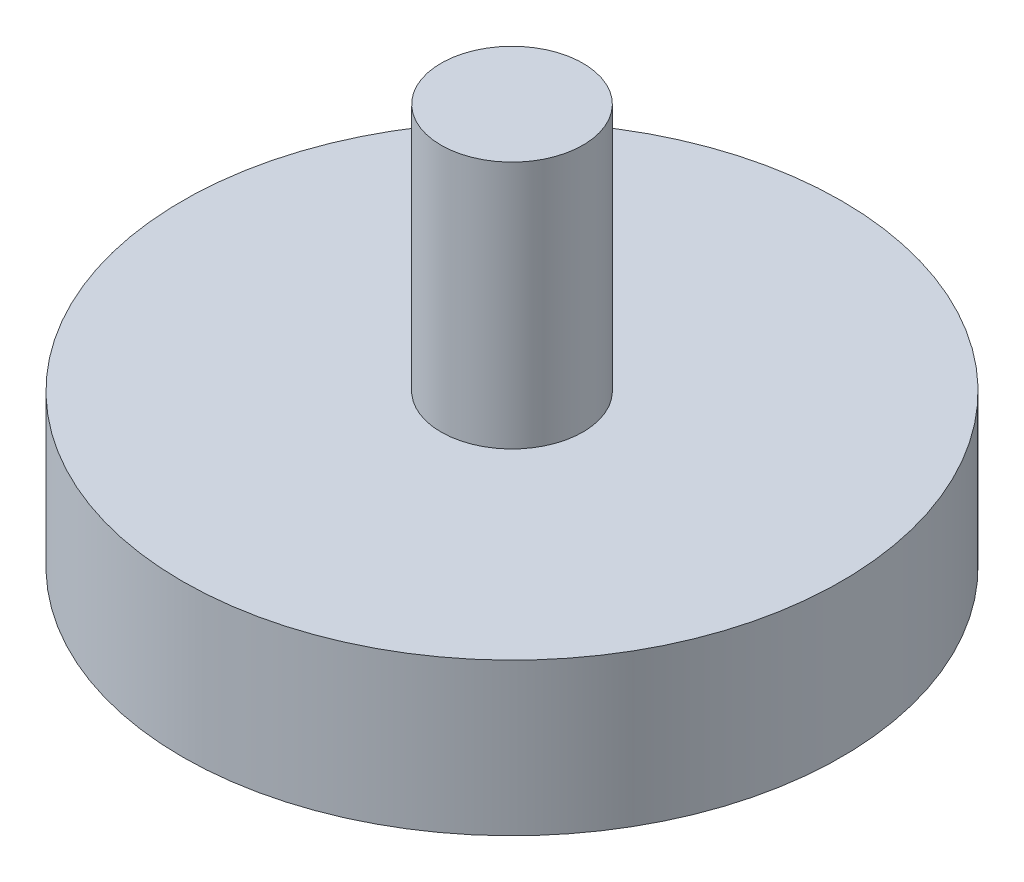
ISO-10303-21;
HEADER;
FILE_DESCRIPTION(('STEP AP214'),'2;1');
FILE_NAME('part.step','',(''),(''),'','','');
FILE_SCHEMA(('AUTOMOTIVE_DESIGN { 1 0 10303 214 1 1 1 1 }'));
ENDSEC;
DATA;
#1=APPLICATION_CONTEXT('core data for automotive mechanical design processes');
#2=APPLICATION_PROTOCOL_DEFINITION('international standard','automotive_design',2000,#1);
#3=PRODUCT_CONTEXT('',#1,'mechanical');
#4=PRODUCT('Part','Part','',(#3));
#5=PRODUCT_RELATED_PRODUCT_CATEGORY('part','',(#4));
#6=PRODUCT_DEFINITION_FORMATION('','',#4);
#7=PRODUCT_DEFINITION_CONTEXT('part definition',#1,'design');
#8=PRODUCT_DEFINITION('design','',#6,#7);
#9=PRODUCT_DEFINITION_SHAPE('','',#8);
#10=(LENGTH_UNIT() NAMED_UNIT(*) SI_UNIT(.MILLI.,.METRE.));
#11=(NAMED_UNIT(*) PLANE_ANGLE_UNIT() SI_UNIT($,.RADIAN.));
#12=(NAMED_UNIT(*) SI_UNIT($,.STERADIAN.) SOLID_ANGLE_UNIT());
#13=UNCERTAINTY_MEASURE_WITH_UNIT(LENGTH_MEASURE(1.E-05),#10,'distance_accuracy_value','');
#14=(GEOMETRIC_REPRESENTATION_CONTEXT(3) GLOBAL_UNCERTAINTY_ASSIGNED_CONTEXT((#13)) GLOBAL_UNIT_ASSIGNED_CONTEXT((#10,
#11,#12)) REPRESENTATION_CONTEXT('',''));
#15=CARTESIAN_POINT('',(0.,0.,0.));
#16=DIRECTION('',(0.,0.,1.));
#17=DIRECTION('',(1.,0.,0.));
#18=AXIS2_PLACEMENT_3D('',#15,#16,#17);
#19=CARTESIAN_POINT('',(0.,-7.62,0.));
#20=DIRECTION('',(0.,1.,0.));
#21=DIRECTION('',(0.,0.,1.));
#22=AXIS2_PLACEMENT_3D('',#19,#20,#21);
#23=CYLINDRICAL_SURFACE('',#22,16.51);
#24=CARTESIAN_POINT('',(0.,-7.62,0.));
#25=DIRECTION('',(0.,1.,0.));
#26=DIRECTION('',(0.,0.,1.));
#27=AXIS2_PLACEMENT_3D('',#24,#25,#26);
#28=CIRCLE('',#27,16.51);
#29=CARTESIAN_POINT('',(0.,-7.62,16.51));
#30=VERTEX_POINT('',#29);
#31=EDGE_CURVE('E11',#30,#30,#28,.T.);
#32=CARTESIAN_POINT('',(0.,0.,0.));
#33=DIRECTION('',(0.,1.,0.));
#34=DIRECTION('',(0.,0.,1.));
#35=AXIS2_PLACEMENT_3D('',#32,#33,#34);
#36=CIRCLE('',#35,16.51);
#37=CARTESIAN_POINT('',(0.,0.,16.51));
#38=VERTEX_POINT('',#37);
#39=EDGE_CURVE('E50',#38,#38,#36,.T.);
#40=CARTESIAN_POINT('',(0.,-7.62,16.51));
#41=CARTESIAN_POINT('',(0.,-7.540625,16.51));
#42=CARTESIAN_POINT('',(0.,-7.46125,16.51));
#43=CARTESIAN_POINT('',(0.,-7.3025,16.51));
#44=CARTESIAN_POINT('',(0.,-7.223125,16.51));
#45=CARTESIAN_POINT('',(0.,-7.064375,16.51));
#46=CARTESIAN_POINT('',(0.,-6.985,16.51));
#47=CARTESIAN_POINT('',(0.,-6.82625,16.51));
#48=CARTESIAN_POINT('',(0.,-6.746875,16.51));
#49=CARTESIAN_POINT('',(0.,-6.588125,16.51));
#50=CARTESIAN_POINT('',(0.,-6.50875,16.51));
#51=CARTESIAN_POINT('',(0.,-6.35,16.51));
#52=CARTESIAN_POINT('',(0.,-6.270625,16.51));
#53=CARTESIAN_POINT('',(0.,-6.111875,16.51));
#54=CARTESIAN_POINT('',(0.,-6.0325,16.51));
#55=CARTESIAN_POINT('',(0.,-5.87375,16.51));
#56=CARTESIAN_POINT('',(0.,-5.794375,16.51));
#57=CARTESIAN_POINT('',(0.,-5.635625,16.51));
#58=CARTESIAN_POINT('',(0.,-5.55625,16.51));
#59=CARTESIAN_POINT('',(0.,-5.3975,16.51));
#60=CARTESIAN_POINT('',(0.,-5.318125,16.51));
#61=CARTESIAN_POINT('',(0.,-5.159375,16.51));
#62=CARTESIAN_POINT('',(0.,-5.08,16.51));
#63=CARTESIAN_POINT('',(0.,-4.92125,16.51));
#64=CARTESIAN_POINT('',(0.,-4.841875,16.51));
#65=CARTESIAN_POINT('',(0.,-4.683125,16.51));
#66=CARTESIAN_POINT('',(0.,-4.60375,16.51));
#67=CARTESIAN_POINT('',(0.,-4.445,16.51));
#68=CARTESIAN_POINT('',(0.,-4.365625,16.51));
#69=CARTESIAN_POINT('',(0.,-4.206875,16.51));
#70=CARTESIAN_POINT('',(0.,-4.1275,16.51));
#71=CARTESIAN_POINT('',(0.,-3.96875,16.51));
#72=CARTESIAN_POINT('',(0.,-3.889375,16.51));
#73=CARTESIAN_POINT('',(0.,-3.730625,16.51));
#74=CARTESIAN_POINT('',(0.,-3.65125,16.51));
#75=CARTESIAN_POINT('',(0.,-3.4925,16.51));
#76=CARTESIAN_POINT('',(0.,-3.413125,16.51));
#77=CARTESIAN_POINT('',(0.,-3.254375,16.51));
#78=CARTESIAN_POINT('',(0.,-3.175,16.51));
#79=CARTESIAN_POINT('',(0.,-3.01625,16.51));
#80=CARTESIAN_POINT('',(0.,-2.936875,16.51));
#81=CARTESIAN_POINT('',(0.,-2.778125,16.51));
#82=CARTESIAN_POINT('',(0.,-2.69875,16.51));
#83=CARTESIAN_POINT('',(0.,-2.54,16.51));
#84=CARTESIAN_POINT('',(0.,-2.460625,16.51));
#85=CARTESIAN_POINT('',(0.,-2.301875,16.51));
#86=CARTESIAN_POINT('',(0.,-2.2225,16.51));
#87=CARTESIAN_POINT('',(0.,-2.06375,16.51));
#88=CARTESIAN_POINT('',(0.,-1.984375,16.51));
#89=CARTESIAN_POINT('',(0.,-1.825625,16.51));
#90=CARTESIAN_POINT('',(0.,-1.74625,16.51));
#91=CARTESIAN_POINT('',(0.,-1.5875,16.51));
#92=CARTESIAN_POINT('',(0.,-1.508125,16.51));
#93=CARTESIAN_POINT('',(0.,-1.349375,16.51));
#94=CARTESIAN_POINT('',(0.,-1.27,16.51));
#95=CARTESIAN_POINT('',(0.,-1.11125,16.51));
#96=CARTESIAN_POINT('',(0.,-1.031875,16.51));
#97=CARTESIAN_POINT('',(0.,-0.873125,16.51));
#98=CARTESIAN_POINT('',(0.,-0.79375,16.51));
#99=CARTESIAN_POINT('',(0.,-0.635,16.51));
#100=CARTESIAN_POINT('',(0.,-0.555625,16.51));
#101=CARTESIAN_POINT('',(0.,-0.396875,16.51));
#102=CARTESIAN_POINT('',(0.,-0.3175,16.51));
#103=CARTESIAN_POINT('',(0.,-0.15875,16.51));
#104=CARTESIAN_POINT('',(0.,-0.0793749999999999,16.51));
#105=CARTESIAN_POINT('',(0.,0.,16.51));
#106=B_SPLINE_CURVE_WITH_KNOTS('',3,(#40,#41,#42,#43,#44,#45,#46,#47,#48,#49,#50,#51,#52,#53,
#54,#55,#56,#57,#58,#59,#60,#61,#62,#63,#64,#65,#66,#67,#68,#69,#70,#71,#72,#73,#74,#75,#76,#77,
#78,#79,#80,#81,#82,#83,#84,#85,#86,#87,#88,#89,#90,#91,#92,#93,#94,#95,#96,#97,#98,#99,#100,
#101,#102,#103,#104,#105),.UNSPECIFIED.,.F.,.F.,(4,2,2,2,2,2,2,2,2,2,2,2,2,2,2,2,2,2,2,2,2,2,2,
2,2,2,2,2,2,2,2,2,4),(0.,0.238125,0.476249999999999,0.714375,0.952499999999999,1.190625,1.42875,
1.666875,1.905,2.143125,2.38125,2.619375,2.8575,3.095625,3.33375,3.571875,3.81,4.048125,4.28625,
4.524375,4.7625,5.000625,5.23875,5.476875,5.715,5.953125,6.19125,6.429375,6.6675,6.905625,
7.14375,7.381875,7.62),.UNSPECIFIED.);
#107=EDGE_CURVE('BSEAM47',#30,#38,#106,.T.);
#108=ORIENTED_EDGE('',*,*,#31,.T.);
#109=ORIENTED_EDGE('',*,*,#39,.F.);
#110=ORIENTED_EDGE('',*,*,#107,.T.);
#111=ORIENTED_EDGE('',*,*,#107,.F.);
#112=EDGE_LOOP('',(#108,#110,#109,#111));
#113=FACE_BOUND('',#112,.T.);
#114=ADVANCED_FACE('F47',(#113),#23,.T.);
#115=CARTESIAN_POINT('',(0.,-7.62,0.));
#116=DIRECTION('',(0.,1.,0.));
#117=DIRECTION('',(0.,0.,1.));
#118=AXIS2_PLACEMENT_3D('',#115,#116,#117);
#119=PLANE('',#118);
#120=ORIENTED_EDGE('',*,*,#31,.F.);
#121=EDGE_LOOP('',(#120));
#122=FACE_BOUND('',#121,.T.);
#123=ADVANCED_FACE('F64',(#122),#119,.F.);
#124=CARTESIAN_POINT('',(0.,0.,0.));
#125=DIRECTION('',(0.,1.,0.));
#126=DIRECTION('',(0.,0.,1.));
#127=AXIS2_PLACEMENT_3D('',#124,#125,#126);
#128=PLANE('',#127);
#129=ORIENTED_EDGE('',*,*,#39,.T.);
#130=EDGE_LOOP('',(#129));
#131=FACE_BOUND('',#130,.T.);
#132=ADVANCED_FACE('F61',(#131),#128,.T.);
#133=CLOSED_SHELL('',(#114,#123,#132));
#134=MANIFOLD_SOLID_BREP('B2',#133);
#135=CARTESIAN_POINT('',(0.,12.446,0.));
#136=DIRECTION('',(0.,-1.,0.));
#137=DIRECTION('',(0.,0.,-1.));
#138=AXIS2_PLACEMENT_3D('',#135,#136,#137);
#139=CYLINDRICAL_SURFACE('',#138,3.556);
#140=CARTESIAN_POINT('',(0.,12.446,0.));
#141=DIRECTION('',(0.,1.,0.));
#142=DIRECTION('',(0.,0.,1.));
#143=AXIS2_PLACEMENT_3D('',#140,#141,#142);
#144=CIRCLE('',#143,3.556);
#145=CARTESIAN_POINT('',(0.,12.446,3.556));
#146=VERTEX_POINT('',#145);
#147=EDGE_CURVE('E46',#146,#146,#144,.T.);
#148=ORIENTED_EDGE('',*,*,#147,.F.);
#149=EDGE_LOOP('',(#148));
#150=FACE_BOUND('',#149,.T.);
#151=CARTESIAN_POINT('',(0.,0.,0.));
#152=DIRECTION('',(0.,1.,0.));
#153=DIRECTION('',(0.,0.,1.));
#154=AXIS2_PLACEMENT_3D('',#151,#152,#153);
#155=CIRCLE('',#154,3.556);
#156=CARTESIAN_POINT('',(0.,0.,3.556));
#157=VERTEX_POINT('',#156);
#158=EDGE_CURVE('E93',#157,#157,#155,.T.);
#159=ORIENTED_EDGE('',*,*,#158,.T.);
#160=EDGE_LOOP('',(#159));
#161=FACE_BOUND('',#160,.T.);
#162=ADVANCED_FACE('F90',(#150,#161),#139,.T.);
#163=CARTESIAN_POINT('',(0.,12.446,0.));
#164=DIRECTION('',(0.,1.,0.));
#165=DIRECTION('',(0.,0.,1.));
#166=AXIS2_PLACEMENT_3D('',#163,#164,#165);
#167=PLANE('',#166);
#168=ORIENTED_EDGE('',*,*,#147,.T.);
#169=EDGE_LOOP('',(#168));
#170=FACE_BOUND('',#169,.T.);
#171=ADVANCED_FACE('F105',(#170),#167,.T.);
#172=CARTESIAN_POINT('',(0.,0.,0.));
#173=DIRECTION('',(0.,1.,0.));
#174=DIRECTION('',(0.,0.,1.));
#175=AXIS2_PLACEMENT_3D('',#172,#173,#174);
#176=PLANE('',#175);
#177=ORIENTED_EDGE('',*,*,#158,.F.);
#178=EDGE_LOOP('',(#177));
#179=FACE_BOUND('',#178,.T.);
#180=ADVANCED_FACE('F103',(#179),#176,.F.);
#181=CLOSED_SHELL('',(#162,#171,#180));
#182=MANIFOLD_SOLID_BREP('B6',#181);
#183=ADVANCED_BREP_SHAPE_REPRESENTATION('',(#18,#134,#182),#14);
#184=SHAPE_DEFINITION_REPRESENTATION(#9,#183);
ENDSEC;
END-ISO-10303-21;
